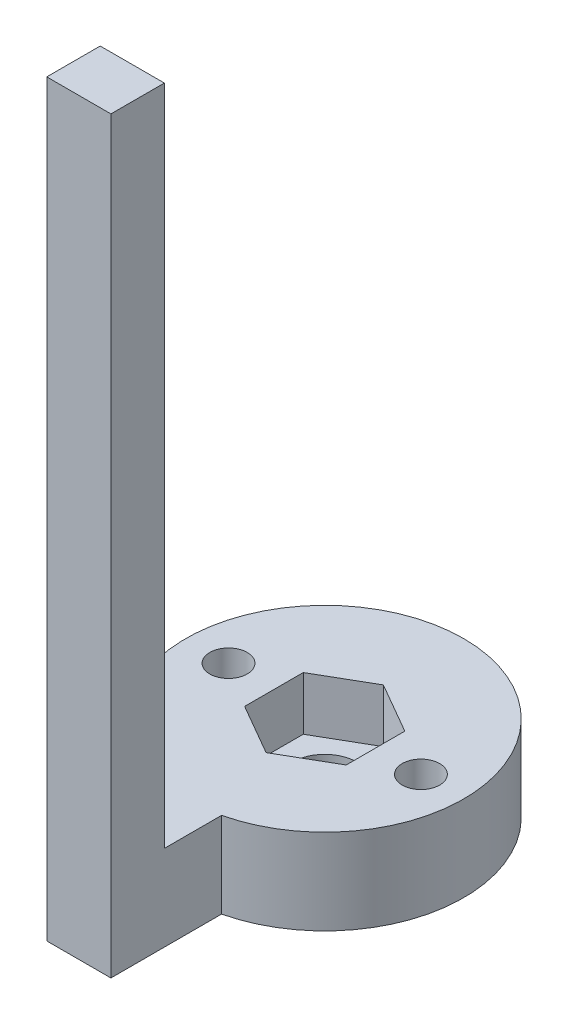
ISO-10303-21;
HEADER;
FILE_DESCRIPTION(('STEP AP214'),'2;1');
FILE_NAME('part.step','',(''),(''),'','','');
FILE_SCHEMA(('AUTOMOTIVE_DESIGN { 1 0 10303 214 1 1 1 1 }'));
ENDSEC;
DATA;
#1=APPLICATION_CONTEXT('core data for automotive mechanical design processes');
#2=APPLICATION_PROTOCOL_DEFINITION('international standard','automotive_design',2000,#1);
#3=PRODUCT_CONTEXT('',#1,'mechanical');
#4=PRODUCT('Part','Part','',(#3));
#5=PRODUCT_RELATED_PRODUCT_CATEGORY('part','',(#4));
#6=PRODUCT_DEFINITION_FORMATION('','',#4);
#7=PRODUCT_DEFINITION_CONTEXT('part definition',#1,'design');
#8=PRODUCT_DEFINITION('design','',#6,#7);
#9=PRODUCT_DEFINITION_SHAPE('','',#8);
#10=(LENGTH_UNIT() NAMED_UNIT(*) SI_UNIT(.MILLI.,.METRE.));
#11=(NAMED_UNIT(*) PLANE_ANGLE_UNIT() SI_UNIT($,.RADIAN.));
#12=(NAMED_UNIT(*) SI_UNIT($,.STERADIAN.) SOLID_ANGLE_UNIT());
#13=UNCERTAINTY_MEASURE_WITH_UNIT(LENGTH_MEASURE(1.E-05),#10,'distance_accuracy_value','');
#14=(GEOMETRIC_REPRESENTATION_CONTEXT(3) GLOBAL_UNCERTAINTY_ASSIGNED_CONTEXT((#13)) GLOBAL_UNIT_ASSIGNED_CONTEXT((#10,
#11,#12)) REPRESENTATION_CONTEXT('',''));
#15=CARTESIAN_POINT('',(0.,0.,0.));
#16=DIRECTION('',(0.,0.,1.));
#17=DIRECTION('',(1.,0.,0.));
#18=AXIS2_PLACEMENT_3D('',#15,#16,#17);
#19=CARTESIAN_POINT('',(0.,8.,0.));
#20=DIRECTION('',(0.,-1.,0.));
#21=DIRECTION('',(0.,0.,-1.));
#22=AXIS2_PLACEMENT_3D('',#19,#20,#21);
#23=CYLINDRICAL_SURFACE('',#22,13.);
#24=DIRECTION('',(0.,-1.,0.));
#25=VECTOR('',#24,1.);
#26=CARTESIAN_POINT('',(3.00000000000002,8.,12.6491106406735));
#27=LINE('',#26,#25);
#28=CARTESIAN_POINT('',(3.00000000000002,0.,12.6491106406735));
#29=VERTEX_POINT('',#28);
#30=CARTESIAN_POINT('',(3.00000000000002,8.,12.6491106406735));
#31=VERTEX_POINT('',#30);
#32=EDGE_CURVE('E186',#29,#31,#27,.F.);
#33=ORIENTED_EDGE('',*,*,#32,.F.);
#34=CARTESIAN_POINT('',(0.,0.,0.));
#35=DIRECTION('',(0.,1.,0.));
#36=DIRECTION('',(0.,0.,1.));
#37=AXIS2_PLACEMENT_3D('',#34,#35,#36);
#38=CIRCLE('',#37,13.);
#39=CARTESIAN_POINT('',(-2.99999999999998,0.,12.6491106406735));
#40=VERTEX_POINT('',#39);
#41=EDGE_CURVE('E50',#29,#40,#38,.T.);
#42=ORIENTED_EDGE('',*,*,#41,.T.);
#43=DIRECTION('',(0.,-1.,0.));
#44=VECTOR('',#43,1.);
#45=CARTESIAN_POINT('',(-2.99999999999998,8.,12.6491106406735));
#46=LINE('',#45,#44);
#47=CARTESIAN_POINT('',(-2.99999999999998,8.,12.6491106406735));
#48=VERTEX_POINT('',#47);
#49=EDGE_CURVE('E183',#40,#48,#46,.F.);
#50=ORIENTED_EDGE('',*,*,#49,.T.);
#51=CARTESIAN_POINT('',(0.,8.,0.));
#52=DIRECTION('',(0.,1.,0.));
#53=DIRECTION('',(0.,0.,1.));
#54=AXIS2_PLACEMENT_3D('',#51,#52,#53);
#55=CIRCLE('',#54,13.);
#56=EDGE_CURVE('E12',#31,#48,#55,.T.);
#57=ORIENTED_EDGE('',*,*,#56,.F.);
#58=EDGE_LOOP('',(#33,#42,#50,#57));
#59=FACE_BOUND('',#58,.T.);
#60=ADVANCED_FACE('F41',(#59),#23,.T.);
#61=CARTESIAN_POINT('',(-9.,0.,0.));
#62=DIRECTION('',(0.,1.,0.));
#63=DIRECTION('',(0.,0.,1.));
#64=AXIS2_PLACEMENT_3D('',#61,#62,#63);
#65=CYLINDRICAL_SURFACE('',#64,1.75);
#66=CARTESIAN_POINT('',(-9.,8.,0.));
#67=DIRECTION('',(0.,-1.,0.));
#68=DIRECTION('',(0.,0.,1.));
#69=AXIS2_PLACEMENT_3D('',#66,#67,#68);
#70=CIRCLE('',#69,1.75);
#71=CARTESIAN_POINT('',(-9.,8.,1.75));
#72=VERTEX_POINT('',#71);
#73=EDGE_CURVE('E211',#72,#72,#70,.T.);
#74=ORIENTED_EDGE('',*,*,#73,.F.);
#75=EDGE_LOOP('',(#74));
#76=FACE_BOUND('',#75,.T.);
#77=CARTESIAN_POINT('',(-9.,3.,0.));
#78=DIRECTION('',(0.,-1.,0.));
#79=DIRECTION('',(0.,0.,-1.));
#80=AXIS2_PLACEMENT_3D('',#77,#78,#79);
#81=CIRCLE('',#80,1.75);
#82=CARTESIAN_POINT('',(-9.,3.,-1.75));
#83=VERTEX_POINT('',#82);
#84=EDGE_CURVE('E44',#83,#83,#81,.T.);
#85=ORIENTED_EDGE('',*,*,#84,.T.);
#86=EDGE_LOOP('',(#85));
#87=FACE_BOUND('',#86,.T.);
#88=ADVANCED_FACE('F297',(#76,#87),#65,.F.);
#89=CARTESIAN_POINT('',(9.,0.,0.));
#90=DIRECTION('',(0.,1.,0.));
#91=DIRECTION('',(0.,0.,1.));
#92=AXIS2_PLACEMENT_3D('',#89,#90,#91);
#93=CYLINDRICAL_SURFACE('',#92,1.75);
#94=CARTESIAN_POINT('',(9.,8.,0.));
#95=DIRECTION('',(0.,1.,0.));
#96=DIRECTION('',(0.,0.,1.));
#97=AXIS2_PLACEMENT_3D('',#94,#95,#96);
#98=CIRCLE('',#97,1.75);
#99=CARTESIAN_POINT('',(9.,8.,1.75));
#100=VERTEX_POINT('',#99);
#101=EDGE_CURVE('E215',#100,#100,#98,.T.);
#102=ORIENTED_EDGE('',*,*,#101,.T.);
#103=EDGE_LOOP('',(#102));
#104=FACE_BOUND('',#103,.T.);
#105=CARTESIAN_POINT('',(9.,3.,0.));
#106=DIRECTION('',(0.,-1.,0.));
#107=DIRECTION('',(0.,0.,-1.));
#108=AXIS2_PLACEMENT_3D('',#105,#106,#107);
#109=CIRCLE('',#108,1.75);
#110=CARTESIAN_POINT('',(9.,3.,-1.75));
#111=VERTEX_POINT('',#110);
#112=EDGE_CURVE('E201',#111,#111,#109,.F.);
#113=ORIENTED_EDGE('',*,*,#112,.F.);
#114=EDGE_LOOP('',(#113));
#115=FACE_BOUND('',#114,.T.);
#116=ADVANCED_FACE('F294',(#104,#115),#93,.F.);
#117=CARTESIAN_POINT('',(0.,8.,0.));
#118=DIRECTION('',(0.,1.,0.));
#119=DIRECTION('',(0.,0.,1.));
#120=AXIS2_PLACEMENT_3D('',#117,#118,#119);
#121=PLANE('',#120);
#122=ORIENTED_EDGE('',*,*,#56,.T.);
#123=DIRECTION('',(0.,0.,-1.));
#124=VECTOR('',#123,1.);
#125=CARTESIAN_POINT('',(-2.99999999999998,8.,18.));
#126=LINE('',#125,#124);
#127=CARTESIAN_POINT('',(-2.99999999999997,8.,18.));
#128=VERTEX_POINT('',#127);
#129=EDGE_CURVE('E58',#128,#48,#126,.T.);
#130=ORIENTED_EDGE('',*,*,#129,.F.);
#131=DIRECTION('',(1.,0.,0.));
#132=VECTOR('',#131,1.);
#133=CARTESIAN_POINT('',(-2.99999999999998,8.,18.));
#134=LINE('',#133,#132);
#135=CARTESIAN_POINT('',(3.00000000000002,8.,18.));
#136=VERTEX_POINT('',#135);
#137=EDGE_CURVE('E161',#128,#136,#134,.T.);
#138=ORIENTED_EDGE('',*,*,#137,.T.);
#139=DIRECTION('',(0.,0.,-1.));
#140=VECTOR('',#139,1.);
#141=CARTESIAN_POINT('',(3.00000000000002,8.,18.));
#142=LINE('',#141,#140);
#143=EDGE_CURVE('E176',#136,#31,#142,.T.);
#144=ORIENTED_EDGE('',*,*,#143,.T.);
#145=EDGE_LOOP('',(#122,#130,#138,#144));
#146=FACE_BOUND('',#145,.T.);
#147=ORIENTED_EDGE('',*,*,#73,.T.);
#148=EDGE_LOOP('',(#147));
#149=FACE_BOUND('',#148,.T.);
#150=ORIENTED_EDGE('',*,*,#101,.F.);
#151=EDGE_LOOP('',(#150));
#152=FACE_BOUND('',#151,.T.);
#153=DIRECTION('',(0.,0.,-1.));
#154=VECTOR('',#153,1.);
#155=CARTESIAN_POINT('',(4.75,8.,2.74241377865072));
#156=LINE('',#155,#154);
#157=CARTESIAN_POINT('',(4.75,8.,2.74241377865072));
#158=VERTEX_POINT('',#157);
#159=CARTESIAN_POINT('',(4.75,8.,-2.74241377865073));
#160=VERTEX_POINT('',#159);
#161=EDGE_CURVE('E66',#158,#160,#156,.T.);
#162=ORIENTED_EDGE('',*,*,#161,.F.);
#163=DIRECTION('',(0.866025403784439,0.,-0.5));
#164=VECTOR('',#163,1.);
#165=CARTESIAN_POINT('',(0.,8.,5.48482755730144));
#166=LINE('',#165,#164);
#167=CARTESIAN_POINT('',(0.,8.,5.48482755730144));
#168=VERTEX_POINT('',#167);
#169=EDGE_CURVE('E224',#168,#158,#166,.T.);
#170=ORIENTED_EDGE('',*,*,#169,.F.);
#171=DIRECTION('',(0.866025403784439,0.,0.5));
#172=VECTOR('',#171,1.);
#173=CARTESIAN_POINT('',(-4.75,8.,2.74241377865072));
#174=LINE('',#173,#172);
#175=CARTESIAN_POINT('',(-4.75,8.,2.74241377865072));
#176=VERTEX_POINT('',#175);
#177=EDGE_CURVE('E259',#176,#168,#174,.T.);
#178=ORIENTED_EDGE('',*,*,#177,.F.);
#179=DIRECTION('',(0.,0.,1.));
#180=VECTOR('',#179,1.);
#181=CARTESIAN_POINT('',(-4.75,8.,-2.74241377865072));
#182=LINE('',#181,#180);
#183=CARTESIAN_POINT('',(-4.75,8.,-2.74241377865072));
#184=VERTEX_POINT('',#183);
#185=EDGE_CURVE('E255',#184,#176,#182,.T.);
#186=ORIENTED_EDGE('',*,*,#185,.F.);
#187=DIRECTION('',(-0.866025403784439,0.,0.5));
#188=VECTOR('',#187,1.);
#189=CARTESIAN_POINT('',(0.,8.,-5.48482755730144));
#190=LINE('',#189,#188);
#191=CARTESIAN_POINT('',(0.,8.,-5.48482755730144));
#192=VERTEX_POINT('',#191);
#193=EDGE_CURVE('E251',#192,#184,#190,.T.);
#194=ORIENTED_EDGE('',*,*,#193,.F.);
#195=DIRECTION('',(-0.866025403784439,0.,-0.5));
#196=VECTOR('',#195,1.);
#197=CARTESIAN_POINT('',(4.75,8.,-2.74241377865073));
#198=LINE('',#197,#196);
#199=EDGE_CURVE('E247',#160,#192,#198,.T.);
#200=ORIENTED_EDGE('',*,*,#199,.F.);
#201=EDGE_LOOP('',(#162,#170,#178,#186,#194,#200));
#202=FACE_BOUND('',#201,.T.);
#203=ADVANCED_FACE('F296',(#146,#149,#152,#202),#121,.T.);
#204=CARTESIAN_POINT('',(0.,0.,0.));
#205=DIRECTION('',(0.,1.,0.));
#206=DIRECTION('',(0.,0.,1.));
#207=AXIS2_PLACEMENT_3D('',#204,#205,#206);
#208=PLANE('',#207);
#209=ORIENTED_EDGE('',*,*,#41,.F.);
#210=DIRECTION('',(0.,0.,-1.));
#211=VECTOR('',#210,1.);
#212=CARTESIAN_POINT('',(3.00000000000003,0.,18.));
#213=LINE('',#212,#211);
#214=CARTESIAN_POINT('',(3.00000000000003,0.,23.));
#215=VERTEX_POINT('',#214);
#216=EDGE_CURVE('E180',#215,#29,#213,.T.);
#217=ORIENTED_EDGE('',*,*,#216,.F.);
#218=DIRECTION('',(1.,0.,0.));
#219=VECTOR('',#218,1.);
#220=CARTESIAN_POINT('',(3.00000000000003,0.,23.));
#221=LINE('',#220,#219);
#222=CARTESIAN_POINT('',(-2.99999999999997,0.,23.));
#223=VERTEX_POINT('',#222);
#224=EDGE_CURVE('E151',#223,#215,#221,.T.);
#225=ORIENTED_EDGE('',*,*,#224,.F.);
#226=DIRECTION('',(0.,0.,-1.));
#227=VECTOR('',#226,1.);
#228=CARTESIAN_POINT('',(-2.99999999999997,0.,18.));
#229=LINE('',#228,#227);
#230=EDGE_CURVE('E166',#223,#40,#229,.T.);
#231=ORIENTED_EDGE('',*,*,#230,.T.);
#232=EDGE_LOOP('',(#209,#217,#225,#231));
#233=FACE_BOUND('',#232,.T.);
#234=CARTESIAN_POINT('',(0.,0.,0.));
#235=DIRECTION('',(0.,1.,0.));
#236=DIRECTION('',(0.,0.,1.));
#237=AXIS2_PLACEMENT_3D('',#234,#235,#236);
#238=CIRCLE('',#237,3.);
#239=CARTESIAN_POINT('',(0.,0.,3.));
#240=VERTEX_POINT('',#239);
#241=EDGE_CURVE('E210',#240,#240,#238,.T.);
#242=ORIENTED_EDGE('',*,*,#241,.T.);
#243=EDGE_LOOP('',(#242));
#244=FACE_BOUND('',#243,.T.);
#245=CARTESIAN_POINT('',(9.,0.,0.));
#246=DIRECTION('',(0.,-1.,0.));
#247=DIRECTION('',(0.,0.,-1.));
#248=AXIS2_PLACEMENT_3D('',#245,#246,#247);
#249=CIRCLE('',#248,3.);
#250=CARTESIAN_POINT('',(9.,0.,-3.));
#251=VERTEX_POINT('',#250);
#252=EDGE_CURVE('E202',#251,#251,#249,.T.);
#253=ORIENTED_EDGE('',*,*,#252,.F.);
#254=EDGE_LOOP('',(#253));
#255=FACE_BOUND('',#254,.T.);
#256=CARTESIAN_POINT('',(-9.,0.,0.));
#257=DIRECTION('',(0.,-1.,0.));
#258=DIRECTION('',(0.,0.,-1.));
#259=AXIS2_PLACEMENT_3D('',#256,#257,#258);
#260=CIRCLE('',#259,3.);
#261=CARTESIAN_POINT('',(-9.,0.,-3.));
#262=VERTEX_POINT('',#261);
#263=EDGE_CURVE('E189',#262,#262,#260,.T.);
#264=ORIENTED_EDGE('',*,*,#263,.F.);
#265=EDGE_LOOP('',(#264));
#266=FACE_BOUND('',#265,.T.);
#267=ADVANCED_FACE('F304',(#233,#244,#255,#266),#208,.F.);
#268=CARTESIAN_POINT('',(4.75,3.,2.74241377865072));
#269=DIRECTION('',(1.,0.,0.));
#270=DIRECTION('',(0.,0.,-1.));
#271=AXIS2_PLACEMENT_3D('',#268,#269,#270);
#272=PLANE('',#271);
#273=ORIENTED_EDGE('',*,*,#161,.T.);
#274=DIRECTION('',(0.,1.,0.));
#275=VECTOR('',#274,1.);
#276=CARTESIAN_POINT('',(4.75,3.,-2.74241377865073));
#277=LINE('',#276,#275);
#278=CARTESIAN_POINT('',(4.75,3.,-2.74241377865073));
#279=VERTEX_POINT('',#278);
#280=EDGE_CURVE('E244',#279,#160,#277,.T.);
#281=ORIENTED_EDGE('',*,*,#280,.F.);
#282=DIRECTION('',(0.,0.,-1.));
#283=VECTOR('',#282,1.);
#284=CARTESIAN_POINT('',(4.75,3.,2.74241377865072));
#285=LINE('',#284,#283);
#286=CARTESIAN_POINT('',(4.75,3.,2.74241377865072));
#287=VERTEX_POINT('',#286);
#288=EDGE_CURVE('E219',#287,#279,#285,.T.);
#289=ORIENTED_EDGE('',*,*,#288,.F.);
#290=DIRECTION('',(0.,1.,0.));
#291=VECTOR('',#290,1.);
#292=CARTESIAN_POINT('',(4.75,3.,2.74241377865072));
#293=LINE('',#292,#291);
#294=EDGE_CURVE('E266',#287,#158,#293,.T.);
#295=ORIENTED_EDGE('',*,*,#294,.T.);
#296=EDGE_LOOP('',(#273,#281,#289,#295));
#297=FACE_BOUND('',#296,.T.);
#298=ADVANCED_FACE('F376',(#297),#272,.F.);
#299=CARTESIAN_POINT('',(0.,3.,5.48482755730144));
#300=DIRECTION('',(0.5,0.,0.866025403784439));
#301=DIRECTION('',(0.866025403784439,0.,-0.5));
#302=AXIS2_PLACEMENT_3D('',#299,#300,#301);
#303=PLANE('',#302);
#304=ORIENTED_EDGE('',*,*,#169,.T.);
#305=ORIENTED_EDGE('',*,*,#294,.F.);
#306=DIRECTION('',(0.866025403784439,0.,-0.5));
#307=VECTOR('',#306,1.);
#308=CARTESIAN_POINT('',(0.,3.,5.48482755730144));
#309=LINE('',#308,#307);
#310=CARTESIAN_POINT('',(0.,3.,5.48482755730144));
#311=VERTEX_POINT('',#310);
#312=EDGE_CURVE('E240',#311,#287,#309,.T.);
#313=ORIENTED_EDGE('',*,*,#312,.F.);
#314=DIRECTION('',(0.,1.,0.));
#315=VECTOR('',#314,1.);
#316=CARTESIAN_POINT('',(0.,3.,5.48482755730144));
#317=LINE('',#316,#315);
#318=EDGE_CURVE('E269',#311,#168,#317,.T.);
#319=ORIENTED_EDGE('',*,*,#318,.T.);
#320=EDGE_LOOP('',(#304,#305,#313,#319));
#321=FACE_BOUND('',#320,.T.);
#322=ADVANCED_FACE('F385',(#321),#303,.F.);
#323=CARTESIAN_POINT('',(-4.75,3.,2.74241377865072));
#324=DIRECTION('',(-0.5,0.,0.866025403784439));
#325=DIRECTION('',(0.866025403784439,0.,0.5));
#326=AXIS2_PLACEMENT_3D('',#323,#324,#325);
#327=PLANE('',#326);
#328=ORIENTED_EDGE('',*,*,#177,.T.);
#329=ORIENTED_EDGE('',*,*,#318,.F.);
#330=DIRECTION('',(0.866025403784439,0.,0.5));
#331=VECTOR('',#330,1.);
#332=CARTESIAN_POINT('',(-4.75,3.,2.74241377865072));
#333=LINE('',#332,#331);
#334=CARTESIAN_POINT('',(-4.75,3.,2.74241377865072));
#335=VERTEX_POINT('',#334);
#336=EDGE_CURVE('E236',#335,#311,#333,.T.);
#337=ORIENTED_EDGE('',*,*,#336,.F.);
#338=DIRECTION('',(0.,1.,0.));
#339=VECTOR('',#338,1.);
#340=CARTESIAN_POINT('',(-4.75,3.,2.74241377865072));
#341=LINE('',#340,#339);
#342=EDGE_CURVE('E272',#335,#176,#341,.T.);
#343=ORIENTED_EDGE('',*,*,#342,.T.);
#344=EDGE_LOOP('',(#328,#329,#337,#343));
#345=FACE_BOUND('',#344,.T.);
#346=ADVANCED_FACE('F398',(#345),#327,.F.);
#347=CARTESIAN_POINT('',(-4.75,3.,-2.74241377865072));
#348=DIRECTION('',(-1.,0.,0.));
#349=DIRECTION('',(0.,0.,1.));
#350=AXIS2_PLACEMENT_3D('',#347,#348,#349);
#351=PLANE('',#350);
#352=ORIENTED_EDGE('',*,*,#185,.T.);
#353=ORIENTED_EDGE('',*,*,#342,.F.);
#354=DIRECTION('',(0.,0.,1.));
#355=VECTOR('',#354,1.);
#356=CARTESIAN_POINT('',(-4.75,3.,-2.74241377865072));
#357=LINE('',#356,#355);
#358=CARTESIAN_POINT('',(-4.75,3.,-2.74241377865072));
#359=VERTEX_POINT('',#358);
#360=EDGE_CURVE('E232',#359,#335,#357,.T.);
#361=ORIENTED_EDGE('',*,*,#360,.F.);
#362=DIRECTION('',(0.,1.,0.));
#363=VECTOR('',#362,1.);
#364=CARTESIAN_POINT('',(-4.75,3.,-2.74241377865072));
#365=LINE('',#364,#363);
#366=EDGE_CURVE('E275',#359,#184,#365,.T.);
#367=ORIENTED_EDGE('',*,*,#366,.T.);
#368=EDGE_LOOP('',(#352,#353,#361,#367));
#369=FACE_BOUND('',#368,.T.);
#370=ADVANCED_FACE('F394',(#369),#351,.F.);
#371=CARTESIAN_POINT('',(0.,3.,-5.48482755730144));
#372=DIRECTION('',(-0.5,0.,-0.866025403784439));
#373=DIRECTION('',(-0.866025403784439,0.,0.5));
#374=AXIS2_PLACEMENT_3D('',#371,#372,#373);
#375=PLANE('',#374);
#376=ORIENTED_EDGE('',*,*,#193,.T.);
#377=ORIENTED_EDGE('',*,*,#366,.F.);
#378=DIRECTION('',(-0.866025403784439,0.,0.5));
#379=VECTOR('',#378,1.);
#380=CARTESIAN_POINT('',(0.,3.,-5.48482755730144));
#381=LINE('',#380,#379);
#382=CARTESIAN_POINT('',(0.,3.,-5.48482755730144));
#383=VERTEX_POINT('',#382);
#384=EDGE_CURVE('E228',#383,#359,#381,.T.);
#385=ORIENTED_EDGE('',*,*,#384,.F.);
#386=DIRECTION('',(0.,1.,0.));
#387=VECTOR('',#386,1.);
#388=CARTESIAN_POINT('',(0.,3.,-5.48482755730144));
#389=LINE('',#388,#387);
#390=EDGE_CURVE('E278',#383,#192,#389,.T.);
#391=ORIENTED_EDGE('',*,*,#390,.T.);
#392=EDGE_LOOP('',(#376,#377,#385,#391));
#393=FACE_BOUND('',#392,.T.);
#394=ADVANCED_FACE('F390',(#393),#375,.F.);
#395=CARTESIAN_POINT('',(4.75,3.,-2.74241377865073));
#396=DIRECTION('',(0.5,0.,-0.866025403784439));
#397=DIRECTION('',(-0.866025403784439,0.,-0.5));
#398=AXIS2_PLACEMENT_3D('',#395,#396,#397);
#399=PLANE('',#398);
#400=ORIENTED_EDGE('',*,*,#199,.T.);
#401=ORIENTED_EDGE('',*,*,#390,.F.);
#402=DIRECTION('',(-0.866025403784439,0.,-0.5));
#403=VECTOR('',#402,1.);
#404=CARTESIAN_POINT('',(4.75,3.,-2.74241377865073));
#405=LINE('',#404,#403);
#406=EDGE_CURVE('E223',#279,#383,#405,.T.);
#407=ORIENTED_EDGE('',*,*,#406,.F.);
#408=ORIENTED_EDGE('',*,*,#280,.T.);
#409=EDGE_LOOP('',(#400,#401,#407,#408));
#410=FACE_BOUND('',#409,.T.);
#411=ADVANCED_FACE('F369',(#410),#399,.F.);
#412=CARTESIAN_POINT('',(0.,3.,0.));
#413=DIRECTION('',(0.,1.,0.));
#414=DIRECTION('',(0.,0.,1.));
#415=AXIS2_PLACEMENT_3D('',#412,#413,#414);
#416=PLANE('',#415);
#417=CARTESIAN_POINT('',(0.,3.,0.));
#418=DIRECTION('',(0.,1.,0.));
#419=DIRECTION('',(0.,0.,1.));
#420=AXIS2_PLACEMENT_3D('',#417,#418,#419);
#421=CIRCLE('',#420,3.);
#422=CARTESIAN_POINT('',(0.,3.,3.));
#423=VERTEX_POINT('',#422);
#424=EDGE_CURVE('E206',#423,#423,#421,.T.);
#425=ORIENTED_EDGE('',*,*,#424,.F.);
#426=EDGE_LOOP('',(#425));
#427=FACE_BOUND('',#426,.T.);
#428=ORIENTED_EDGE('',*,*,#288,.T.);
#429=ORIENTED_EDGE('',*,*,#406,.T.);
#430=ORIENTED_EDGE('',*,*,#384,.T.);
#431=ORIENTED_EDGE('',*,*,#360,.T.);
#432=ORIENTED_EDGE('',*,*,#336,.T.);
#433=ORIENTED_EDGE('',*,*,#312,.T.);
#434=EDGE_LOOP('',(#428,#429,#430,#431,#432,#433));
#435=FACE_BOUND('',#434,.T.);
#436=ADVANCED_FACE('F364',(#427,#435),#416,.T.);
#437=CARTESIAN_POINT('',(0.,-2.,0.));
#438=DIRECTION('',(0.,1.,0.));
#439=DIRECTION('',(0.,0.,1.));
#440=AXIS2_PLACEMENT_3D('',#437,#438,#439);
#441=CYLINDRICAL_SURFACE('',#440,3.);
#442=ORIENTED_EDGE('',*,*,#424,.T.);
#443=EDGE_LOOP('',(#442));
#444=FACE_BOUND('',#443,.T.);
#445=ORIENTED_EDGE('',*,*,#241,.F.);
#446=EDGE_LOOP('',(#445));
#447=FACE_BOUND('',#446,.T.);
#448=ADVANCED_FACE('F358',(#444,#447),#441,.F.);
#449=CARTESIAN_POINT('',(9.,3.,0.));
#450=DIRECTION('',(0.,-1.,0.));
#451=DIRECTION('',(0.,0.,-1.));
#452=AXIS2_PLACEMENT_3D('',#449,#450,#451);
#453=PLANE('',#452);
#454=CARTESIAN_POINT('',(9.,3.,0.));
#455=DIRECTION('',(0.,-1.,0.));
#456=DIRECTION('',(0.,0.,-1.));
#457=AXIS2_PLACEMENT_3D('',#454,#455,#456);
#458=CIRCLE('',#457,3.);
#459=CARTESIAN_POINT('',(9.,3.,-3.));
#460=VERTEX_POINT('',#459);
#461=EDGE_CURVE('E197',#460,#460,#458,.T.);
#462=ORIENTED_EDGE('',*,*,#461,.T.);
#463=EDGE_LOOP('',(#462));
#464=FACE_BOUND('',#463,.T.);
#465=ORIENTED_EDGE('',*,*,#112,.T.);
#466=EDGE_LOOP('',(#465));
#467=FACE_BOUND('',#466,.T.);
#468=ADVANCED_FACE('F292',(#464,#467),#453,.T.);
#469=CARTESIAN_POINT('',(9.,3.,0.));
#470=DIRECTION('',(0.,-1.,0.));
#471=DIRECTION('',(0.,0.,-1.));
#472=AXIS2_PLACEMENT_3D('',#469,#470,#471);
#473=CYLINDRICAL_SURFACE('',#472,3.);
#474=ORIENTED_EDGE('',*,*,#461,.F.);
#475=EDGE_LOOP('',(#474));
#476=FACE_BOUND('',#475,.T.);
#477=ORIENTED_EDGE('',*,*,#252,.T.);
#478=EDGE_LOOP('',(#477));
#479=FACE_BOUND('',#478,.T.);
#480=ADVANCED_FACE('F354',(#476,#479),#473,.F.);
#481=CARTESIAN_POINT('',(-9.,3.,0.));
#482=DIRECTION('',(0.,-1.,0.));
#483=DIRECTION('',(0.,0.,-1.));
#484=AXIS2_PLACEMENT_3D('',#481,#482,#483);
#485=CYLINDRICAL_SURFACE('',#484,3.);
#486=CARTESIAN_POINT('',(-9.,3.,0.));
#487=DIRECTION('',(0.,-1.,0.));
#488=DIRECTION('',(0.,0.,-1.));
#489=AXIS2_PLACEMENT_3D('',#486,#487,#488);
#490=CIRCLE('',#489,3.);
#491=CARTESIAN_POINT('',(-9.,3.,-3.));
#492=VERTEX_POINT('',#491);
#493=EDGE_CURVE('E190',#492,#492,#490,.T.);
#494=ORIENTED_EDGE('',*,*,#493,.F.);
#495=EDGE_LOOP('',(#494));
#496=FACE_BOUND('',#495,.T.);
#497=ORIENTED_EDGE('',*,*,#263,.T.);
#498=EDGE_LOOP('',(#497));
#499=FACE_BOUND('',#498,.T.);
#500=ADVANCED_FACE('F350',(#496,#499),#485,.F.);
#501=CARTESIAN_POINT('',(-9.,3.,0.));
#502=DIRECTION('',(0.,-1.,0.));
#503=DIRECTION('',(0.,0.,-1.));
#504=AXIS2_PLACEMENT_3D('',#501,#502,#503);
#505=PLANE('',#504);
#506=ORIENTED_EDGE('',*,*,#84,.F.);
#507=EDGE_LOOP('',(#506));
#508=FACE_BOUND('',#507,.T.);
#509=ORIENTED_EDGE('',*,*,#493,.T.);
#510=EDGE_LOOP('',(#509));
#511=FACE_BOUND('',#510,.T.);
#512=ADVANCED_FACE('F347',(#508,#511),#505,.T.);
#513=CARTESIAN_POINT('',(3.00000000000003,0.,18.));
#514=DIRECTION('',(-1.,0.,0.));
#515=DIRECTION('',(0.,0.,1.));
#516=AXIS2_PLACEMENT_3D('',#513,#514,#515);
#517=PLANE('',#516);
#518=ORIENTED_EDGE('',*,*,#216,.T.);
#519=ORIENTED_EDGE('',*,*,#32,.T.);
#520=ORIENTED_EDGE('',*,*,#143,.F.);
#521=DIRECTION('',(0.,1.,0.));
#522=VECTOR('',#521,1.);
#523=CARTESIAN_POINT('',(3.00000000000003,0.,18.));
#524=LINE('',#523,#522);
#525=CARTESIAN_POINT('',(3.00000000000003,70.,18.));
#526=VERTEX_POINT('',#525);
#527=EDGE_CURVE('E158',#136,#526,#524,.T.);
#528=ORIENTED_EDGE('',*,*,#527,.T.);
#529=DIRECTION('',(0.,0.,-1.));
#530=VECTOR('',#529,1.);
#531=CARTESIAN_POINT('',(3.00000000000003,70.,23.));
#532=LINE('',#531,#530);
#533=CARTESIAN_POINT('',(3.00000000000003,70.,23.));
#534=VERTEX_POINT('',#533);
#535=EDGE_CURVE('E137',#534,#526,#532,.T.);
#536=ORIENTED_EDGE('',*,*,#535,.F.);
#537=DIRECTION('',(0.,1.,0.));
#538=VECTOR('',#537,1.);
#539=CARTESIAN_POINT('',(3.00000000000003,0.,23.));
#540=LINE('',#539,#538);
#541=EDGE_CURVE('E145',#215,#534,#540,.T.);
#542=ORIENTED_EDGE('',*,*,#541,.F.);
#543=EDGE_LOOP('',(#518,#519,#520,#528,#536,#542));
#544=FACE_BOUND('',#543,.T.);
#545=ADVANCED_FACE('F156',(#544),#517,.F.);
#546=CARTESIAN_POINT('',(-2.99999999999997,0.,18.));
#547=DIRECTION('',(-1.,0.,0.));
#548=DIRECTION('',(0.,0.,1.));
#549=AXIS2_PLACEMENT_3D('',#546,#547,#548);
#550=PLANE('',#549);
#551=ORIENTED_EDGE('',*,*,#49,.F.);
#552=ORIENTED_EDGE('',*,*,#230,.F.);
#553=DIRECTION('',(0.,-1.,0.));
#554=VECTOR('',#553,1.);
#555=CARTESIAN_POINT('',(-2.99999999999997,0.,23.));
#556=LINE('',#555,#554);
#557=CARTESIAN_POINT('',(-2.99999999999997,70.,23.));
#558=VERTEX_POINT('',#557);
#559=EDGE_CURVE('E144',#558,#223,#556,.T.);
#560=ORIENTED_EDGE('',*,*,#559,.F.);
#561=DIRECTION('',(0.,0.,-1.));
#562=VECTOR('',#561,1.);
#563=CARTESIAN_POINT('',(-2.99999999999997,70.,23.));
#564=LINE('',#563,#562);
#565=CARTESIAN_POINT('',(-2.99999999999997,70.,18.));
#566=VERTEX_POINT('',#565);
#567=EDGE_CURVE('E139',#558,#566,#564,.T.);
#568=ORIENTED_EDGE('',*,*,#567,.T.);
#569=DIRECTION('',(0.,-1.,0.));
#570=VECTOR('',#569,1.);
#571=CARTESIAN_POINT('',(-2.99999999999997,0.,18.));
#572=LINE('',#571,#570);
#573=EDGE_CURVE('E154',#566,#128,#572,.T.);
#574=ORIENTED_EDGE('',*,*,#573,.T.);
#575=ORIENTED_EDGE('',*,*,#129,.T.);
#576=EDGE_LOOP('',(#551,#552,#560,#568,#574,#575));
#577=FACE_BOUND('',#576,.T.);
#578=ADVANCED_FACE('F319',(#577),#550,.T.);
#579=CARTESIAN_POINT('',(3.00000000000003,70.,23.));
#580=DIRECTION('',(0.,-1.,0.));
#581=DIRECTION('',(0.,0.,-1.));
#582=AXIS2_PLACEMENT_3D('',#579,#580,#581);
#583=PLANE('',#582);
#584=DIRECTION('',(-1.,0.,0.));
#585=VECTOR('',#584,1.);
#586=CARTESIAN_POINT('',(3.00000000000003,70.,18.));
#587=LINE('',#586,#585);
#588=EDGE_CURVE('E327',#526,#566,#587,.T.);
#589=ORIENTED_EDGE('',*,*,#588,.T.);
#590=ORIENTED_EDGE('',*,*,#567,.F.);
#591=DIRECTION('',(-1.,0.,0.));
#592=VECTOR('',#591,1.);
#593=CARTESIAN_POINT('',(3.00000000000003,70.,23.));
#594=LINE('',#593,#592);
#595=EDGE_CURVE('E133',#534,#558,#594,.T.);
#596=ORIENTED_EDGE('',*,*,#595,.F.);
#597=ORIENTED_EDGE('',*,*,#535,.T.);
#598=EDGE_LOOP('',(#589,#590,#596,#597));
#599=FACE_BOUND('',#598,.T.);
#600=ADVANCED_FACE('F135',(#599),#583,.F.);
#601=CARTESIAN_POINT('',(0.,0.,23.));
#602=DIRECTION('',(0.,0.,1.));
#603=DIRECTION('',(1.,0.,0.));
#604=AXIS2_PLACEMENT_3D('',#601,#602,#603);
#605=PLANE('',#604);
#606=ORIENTED_EDGE('',*,*,#541,.T.);
#607=ORIENTED_EDGE('',*,*,#595,.T.);
#608=ORIENTED_EDGE('',*,*,#559,.T.);
#609=ORIENTED_EDGE('',*,*,#224,.T.);
#610=EDGE_LOOP('',(#606,#607,#608,#609));
#611=FACE_BOUND('',#610,.T.);
#612=ADVANCED_FACE('F149',(#611),#605,.T.);
#613=CARTESIAN_POINT('',(0.,0.,18.));
#614=DIRECTION('',(0.,0.,1.));
#615=DIRECTION('',(1.,0.,0.));
#616=AXIS2_PLACEMENT_3D('',#613,#614,#615);
#617=PLANE('',#616);
#618=ORIENTED_EDGE('',*,*,#137,.F.);
#619=ORIENTED_EDGE('',*,*,#573,.F.);
#620=ORIENTED_EDGE('',*,*,#588,.F.);
#621=ORIENTED_EDGE('',*,*,#527,.F.);
#622=EDGE_LOOP('',(#618,#619,#620,#621));
#623=FACE_BOUND('',#622,.T.);
#624=ADVANCED_FACE('F333',(#623),#617,.F.);
#625=CLOSED_SHELL('',(#60,#88,#116,#203,#267,#298,#322,#346,#370,#394,#411,#436,#448,#468,#480,
#500,#512,#545,#578,#600,#612,#624));
#626=MANIFOLD_SOLID_BREP('B2',#625);
#627=ADVANCED_BREP_SHAPE_REPRESENTATION('',(#18,#626),#14);
#628=SHAPE_DEFINITION_REPRESENTATION(#9,#627);
ENDSEC;
END-ISO-10303-21;
